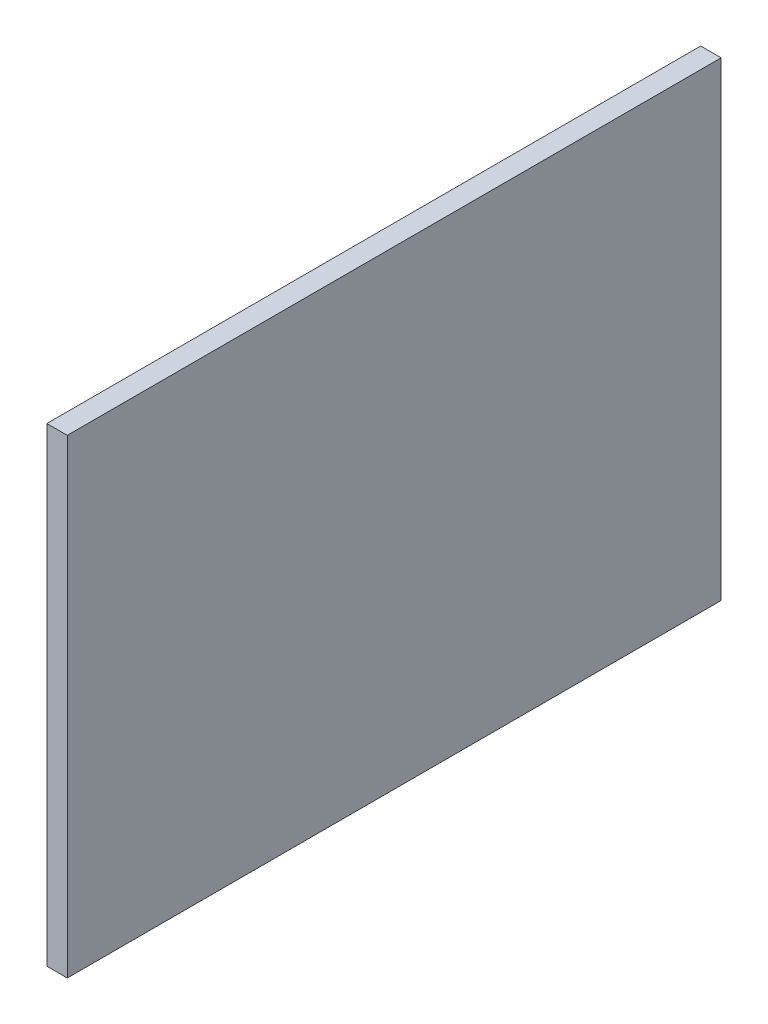
ISO-10303-21;
HEADER;
FILE_DESCRIPTION(('STEP AP214'),'2;1');
FILE_NAME('part.step','',(''),(''),'','','');
FILE_SCHEMA(('AUTOMOTIVE_DESIGN { 1 0 10303 214 1 1 1 1 }'));
ENDSEC;
DATA;
#1=APPLICATION_CONTEXT('core data for automotive mechanical design processes');
#2=APPLICATION_PROTOCOL_DEFINITION('international standard','automotive_design',2000,#1);
#3=PRODUCT_CONTEXT('',#1,'mechanical');
#4=PRODUCT('Part','Part','',(#3));
#5=PRODUCT_RELATED_PRODUCT_CATEGORY('part','',(#4));
#6=PRODUCT_DEFINITION_FORMATION('','',#4);
#7=PRODUCT_DEFINITION_CONTEXT('part definition',#1,'design');
#8=PRODUCT_DEFINITION('design','',#6,#7);
#9=PRODUCT_DEFINITION_SHAPE('','',#8);
#10=(LENGTH_UNIT() NAMED_UNIT(*) SI_UNIT(.MILLI.,.METRE.));
#11=(NAMED_UNIT(*) PLANE_ANGLE_UNIT() SI_UNIT($,.RADIAN.));
#12=(NAMED_UNIT(*) SI_UNIT($,.STERADIAN.) SOLID_ANGLE_UNIT());
#13=UNCERTAINTY_MEASURE_WITH_UNIT(LENGTH_MEASURE(1.E-05),#10,'distance_accuracy_value','');
#14=(GEOMETRIC_REPRESENTATION_CONTEXT(3) GLOBAL_UNCERTAINTY_ASSIGNED_CONTEXT((#13)) GLOBAL_UNIT_ASSIGNED_CONTEXT((#10,
#11,#12)) REPRESENTATION_CONTEXT('',''));
#15=CARTESIAN_POINT('',(0.,0.,0.));
#16=DIRECTION('',(0.,0.,1.));
#17=DIRECTION('',(1.,0.,0.));
#18=AXIS2_PLACEMENT_3D('',#15,#16,#17);
#19=CARTESIAN_POINT('',(5.,54.1496204615057,105.941693651863));
#20=DIRECTION('',(0.,0.,-1.));
#21=DIRECTION('',(0.,1.,0.));
#22=AXIS2_PLACEMENT_3D('',#19,#20,#21);
#23=PLANE('',#22);
#24=DIRECTION('',(0.,-1.,0.));
#25=VECTOR('',#24,1.);
#26=CARTESIAN_POINT('',(0.,54.1496204615057,105.941693651863));
#27=LINE('',#26,#25);
#28=CARTESIAN_POINT('',(0.,54.1496204615057,105.941693651863));
#29=VERTEX_POINT('',#28);
#30=CARTESIAN_POINT('',(0.,-60.8503795384943,105.941693651863));
#31=VERTEX_POINT('',#30);
#32=EDGE_CURVE('E94',#29,#31,#27,.T.);
#33=ORIENTED_EDGE('',*,*,#32,.T.);
#34=DIRECTION('',(-1.,0.,0.));
#35=VECTOR('',#34,1.);
#36=CARTESIAN_POINT('',(5.,-60.8503795384943,105.941693651863));
#37=LINE('',#36,#35);
#38=CARTESIAN_POINT('',(5.,-60.8503795384943,105.941693651863));
#39=VERTEX_POINT('',#38);
#40=EDGE_CURVE('E11',#39,#31,#37,.T.);
#41=ORIENTED_EDGE('',*,*,#40,.F.);
#42=DIRECTION('',(0.,-1.,0.));
#43=VECTOR('',#42,1.);
#44=CARTESIAN_POINT('',(5.,54.1496204615057,105.941693651863));
#45=LINE('',#44,#43);
#46=CARTESIAN_POINT('',(5.,54.1496204615057,105.941693651863));
#47=VERTEX_POINT('',#46);
#48=EDGE_CURVE('E82',#47,#39,#45,.T.);
#49=ORIENTED_EDGE('',*,*,#48,.F.);
#50=DIRECTION('',(-1.,0.,0.));
#51=VECTOR('',#50,1.);
#52=CARTESIAN_POINT('',(5.,54.1496204615057,105.941693651863));
#53=LINE('',#52,#51);
#54=EDGE_CURVE('E90',#47,#29,#53,.T.);
#55=ORIENTED_EDGE('',*,*,#54,.T.);
#56=EDGE_LOOP('',(#33,#41,#49,#55));
#57=FACE_BOUND('',#56,.T.);
#58=ADVANCED_FACE('F31',(#57),#23,.F.);
#59=CARTESIAN_POINT('',(5.,-60.8503795384943,105.941693651863));
#60=DIRECTION('',(0.,1.,0.));
#61=DIRECTION('',(0.,0.,1.));
#62=AXIS2_PLACEMENT_3D('',#59,#60,#61);
#63=PLANE('',#62);
#64=DIRECTION('',(0.,0.,-1.));
#65=VECTOR('',#64,1.);
#66=CARTESIAN_POINT('',(0.,-60.8503795384943,105.941693651863));
#67=LINE('',#66,#65);
#68=CARTESIAN_POINT('',(0.,-60.8503795384943,-54.0583063481373));
#69=VERTEX_POINT('',#68);
#70=EDGE_CURVE('E86',#31,#69,#67,.T.);
#71=ORIENTED_EDGE('',*,*,#70,.T.);
#72=DIRECTION('',(-1.,0.,0.));
#73=VECTOR('',#72,1.);
#74=CARTESIAN_POINT('',(5.,-60.8503795384943,-54.0583063481373));
#75=LINE('',#74,#73);
#76=CARTESIAN_POINT('',(5.,-60.8503795384943,-54.0583063481373));
#77=VERTEX_POINT('',#76);
#78=EDGE_CURVE('E39',#77,#69,#75,.T.);
#79=ORIENTED_EDGE('',*,*,#78,.F.);
#80=DIRECTION('',(0.,0.,-1.));
#81=VECTOR('',#80,1.);
#82=CARTESIAN_POINT('',(5.,-60.8503795384943,105.941693651863));
#83=LINE('',#82,#81);
#84=EDGE_CURVE('E77',#39,#77,#83,.T.);
#85=ORIENTED_EDGE('',*,*,#84,.F.);
#86=ORIENTED_EDGE('',*,*,#40,.T.);
#87=EDGE_LOOP('',(#71,#79,#85,#86));
#88=FACE_BOUND('',#87,.T.);
#89=ADVANCED_FACE('F85',(#88),#63,.F.);
#90=CARTESIAN_POINT('',(5.,54.1496204615057,-54.0583063481373));
#91=DIRECTION('',(0.,0.,1.));
#92=DIRECTION('',(0.,-1.,0.));
#93=AXIS2_PLACEMENT_3D('',#90,#91,#92);
#94=PLANE('',#93);
#95=DIRECTION('',(0.,1.,0.));
#96=VECTOR('',#95,1.);
#97=CARTESIAN_POINT('',(0.,54.1496204615057,-54.0583063481373));
#98=LINE('',#97,#96);
#99=CARTESIAN_POINT('',(0.,54.1496204615057,-54.0583063481373));
#100=VERTEX_POINT('',#99);
#101=EDGE_CURVE('E64',#69,#100,#98,.T.);
#102=ORIENTED_EDGE('',*,*,#101,.T.);
#103=DIRECTION('',(-1.,0.,0.));
#104=VECTOR('',#103,1.);
#105=CARTESIAN_POINT('',(5.,54.1496204615057,-54.0583063481373));
#106=LINE('',#105,#104);
#107=CARTESIAN_POINT('',(5.,54.1496204615057,-54.0583063481373));
#108=VERTEX_POINT('',#107);
#109=EDGE_CURVE('E87',#108,#100,#106,.T.);
#110=ORIENTED_EDGE('',*,*,#109,.F.);
#111=DIRECTION('',(0.,1.,0.));
#112=VECTOR('',#111,1.);
#113=CARTESIAN_POINT('',(5.,54.1496204615057,-54.0583063481373));
#114=LINE('',#113,#112);
#115=EDGE_CURVE('E80',#77,#108,#114,.T.);
#116=ORIENTED_EDGE('',*,*,#115,.F.);
#117=ORIENTED_EDGE('',*,*,#78,.T.);
#118=EDGE_LOOP('',(#102,#110,#116,#117));
#119=FACE_BOUND('',#118,.T.);
#120=ADVANCED_FACE('F88',(#119),#94,.F.);
#121=CARTESIAN_POINT('',(5.,54.1496204615057,105.941693651863));
#122=DIRECTION('',(0.,-1.,0.));
#123=DIRECTION('',(0.,0.,-1.));
#124=AXIS2_PLACEMENT_3D('',#121,#122,#123);
#125=PLANE('',#124);
#126=DIRECTION('',(0.,0.,1.));
#127=VECTOR('',#126,1.);
#128=CARTESIAN_POINT('',(0.,54.1496204615057,105.941693651863));
#129=LINE('',#128,#127);
#130=EDGE_CURVE('E70',#100,#29,#129,.T.);
#131=ORIENTED_EDGE('',*,*,#130,.T.);
#132=ORIENTED_EDGE('',*,*,#54,.F.);
#133=DIRECTION('',(0.,0.,1.));
#134=VECTOR('',#133,1.);
#135=CARTESIAN_POINT('',(5.,54.1496204615057,105.941693651863));
#136=LINE('',#135,#134);
#137=EDGE_CURVE('E47',#108,#47,#136,.T.);
#138=ORIENTED_EDGE('',*,*,#137,.F.);
#139=ORIENTED_EDGE('',*,*,#109,.T.);
#140=EDGE_LOOP('',(#131,#132,#138,#139));
#141=FACE_BOUND('',#140,.T.);
#142=ADVANCED_FACE('F101',(#141),#125,.F.);
#143=CARTESIAN_POINT('',(5.,-60.8503795384943,105.941693651863));
#144=DIRECTION('',(1.,0.,0.));
#145=DIRECTION('',(0.,0.,-1.));
#146=AXIS2_PLACEMENT_3D('',#143,#144,#145);
#147=PLANE('',#146);
#148=ORIENTED_EDGE('',*,*,#48,.T.);
#149=ORIENTED_EDGE('',*,*,#84,.T.);
#150=ORIENTED_EDGE('',*,*,#115,.T.);
#151=ORIENTED_EDGE('',*,*,#137,.T.);
#152=EDGE_LOOP('',(#148,#149,#150,#151));
#153=FACE_BOUND('',#152,.T.);
#154=ADVANCED_FACE('F78',(#153),#147,.T.);
#155=CARTESIAN_POINT('',(0.,-60.8503795384943,105.941693651863));
#156=DIRECTION('',(1.,0.,0.));
#157=DIRECTION('',(0.,0.,-1.));
#158=AXIS2_PLACEMENT_3D('',#155,#156,#157);
#159=PLANE('',#158);
#160=ORIENTED_EDGE('',*,*,#32,.F.);
#161=ORIENTED_EDGE('',*,*,#130,.F.);
#162=ORIENTED_EDGE('',*,*,#101,.F.);
#163=ORIENTED_EDGE('',*,*,#70,.F.);
#164=EDGE_LOOP('',(#160,#161,#162,#163));
#165=FACE_BOUND('',#164,.T.);
#166=ADVANCED_FACE('F104',(#165),#159,.F.);
#167=CLOSED_SHELL('',(#58,#89,#120,#142,#154,#166));
#168=MANIFOLD_SOLID_BREP('B2',#167);
#169=ADVANCED_BREP_SHAPE_REPRESENTATION('',(#18,#168),#14);
#170=SHAPE_DEFINITION_REPRESENTATION(#9,#169);
ENDSEC;
END-ISO-10303-21;
